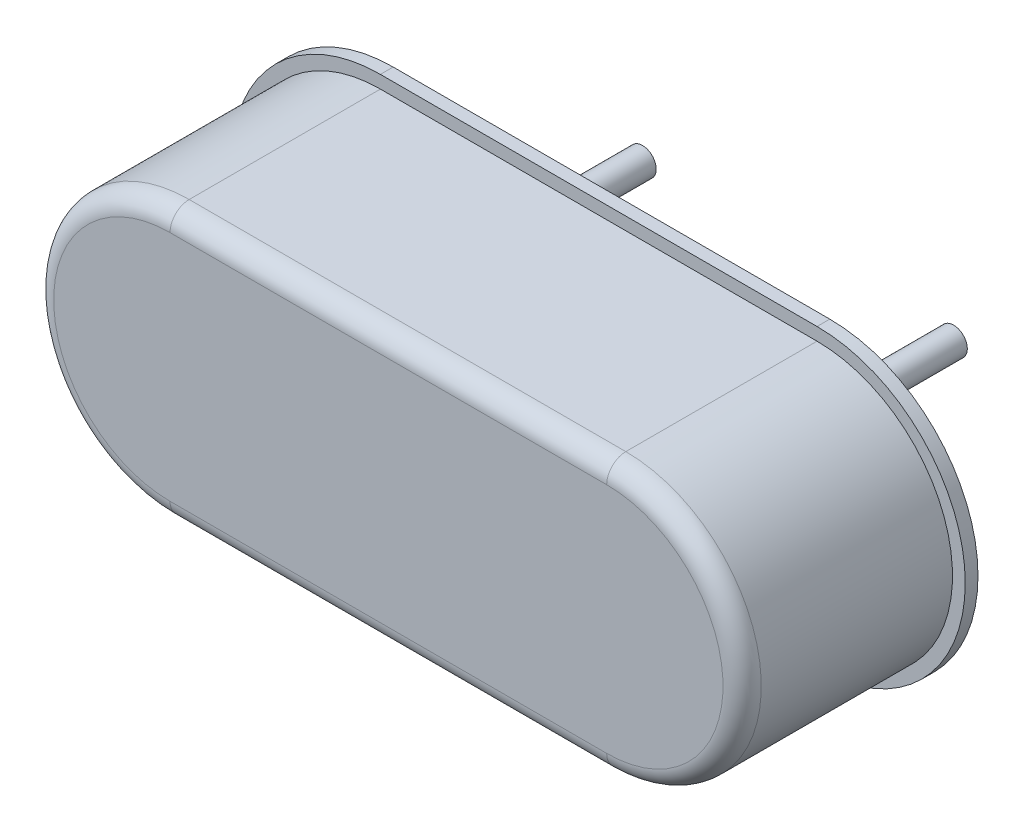
ISO-10303-21;
HEADER;
FILE_DESCRIPTION(('STEP AP214'),'2;1');
FILE_NAME('part.step','',(''),(''),'','','');
FILE_SCHEMA(('AUTOMOTIVE_DESIGN { 1 0 10303 214 1 1 1 1 }'));
ENDSEC;
DATA;
#1=APPLICATION_CONTEXT('core data for automotive mechanical design processes');
#2=APPLICATION_PROTOCOL_DEFINITION('international standard','automotive_design',2000,#1);
#3=PRODUCT_CONTEXT('',#1,'mechanical');
#4=PRODUCT('Part','Part','',(#3));
#5=PRODUCT_RELATED_PRODUCT_CATEGORY('part','',(#4));
#6=PRODUCT_DEFINITION_FORMATION('','',#4);
#7=PRODUCT_DEFINITION_CONTEXT('part definition',#1,'design');
#8=PRODUCT_DEFINITION('design','',#6,#7);
#9=PRODUCT_DEFINITION_SHAPE('','',#8);
#10=(LENGTH_UNIT() NAMED_UNIT(*) SI_UNIT(.MILLI.,.METRE.));
#11=(NAMED_UNIT(*) PLANE_ANGLE_UNIT() SI_UNIT($,.RADIAN.));
#12=(NAMED_UNIT(*) SI_UNIT($,.STERADIAN.) SOLID_ANGLE_UNIT());
#13=UNCERTAINTY_MEASURE_WITH_UNIT(LENGTH_MEASURE(1.E-05),#10,'distance_accuracy_value','');
#14=(GEOMETRIC_REPRESENTATION_CONTEXT(3) GLOBAL_UNCERTAINTY_ASSIGNED_CONTEXT((#13)) GLOBAL_UNIT_ASSIGNED_CONTEXT((#10,
#11,#12)) REPRESENTATION_CONTEXT('',''));
#15=CARTESIAN_POINT('',(0.,0.,0.));
#16=DIRECTION('',(0.,0.,1.));
#17=DIRECTION('',(1.,0.,0.));
#18=AXIS2_PLACEMENT_3D('',#15,#16,#17);
#19=CARTESIAN_POINT('',(1.4682734375,0.,-3.));
#20=DIRECTION('',(0.,0.,-1.));
#21=DIRECTION('',(0.,-1.,0.));
#22=AXIS2_PLACEMENT_3D('',#19,#20,#21);
#23=PLANE('',#22);
#24=CARTESIAN_POINT('',(2.3802734375,0.,-3.));
#25=DIRECTION('',(0.,0.,-1.));
#26=DIRECTION('',(-1.,0.,0.));
#27=AXIS2_PLACEMENT_3D('',#24,#25,#26);
#28=CIRCLE('',#27,0.215);
#29=CARTESIAN_POINT('',(2.1652734375,0.,-3.));
#30=VERTEX_POINT('',#29);
#31=EDGE_CURVE('E127',#30,#30,#28,.T.);
#32=ORIENTED_EDGE('',*,*,#31,.T.);
#33=EDGE_LOOP('',(#32));
#34=FACE_BOUND('',#33,.T.);
#35=ADVANCED_FACE('F16',(#34),#23,.T.);
#36=CARTESIAN_POINT('',(-3.4117265625,0.,-3.));
#37=DIRECTION('',(0.,0.,-1.));
#38=DIRECTION('',(0.,-1.,0.));
#39=AXIS2_PLACEMENT_3D('',#36,#37,#38);
#40=PLANE('',#39);
#41=CARTESIAN_POINT('',(-2.4997265625,0.,-3.));
#42=DIRECTION('',(0.,0.,-1.));
#43=DIRECTION('',(-1.,0.,0.));
#44=AXIS2_PLACEMENT_3D('',#41,#42,#43);
#45=CIRCLE('',#44,0.215);
#46=CARTESIAN_POINT('',(-2.7147265625,0.,-3.));
#47=VERTEX_POINT('',#46);
#48=EDGE_CURVE('E179',#47,#47,#45,.T.);
#49=ORIENTED_EDGE('',*,*,#48,.T.);
#50=EDGE_LOOP('',(#49));
#51=FACE_BOUND('',#50,.T.);
#52=ADVANCED_FACE('F198',(#51),#40,.T.);
#53=CARTESIAN_POINT('',(3.4382734375,-1.825,3.2));
#54=DIRECTION('',(1.,0.,0.));
#55=DIRECTION('',(0.,1.,0.));
#56=AXIS2_PLACEMENT_3D('',#53,#54,#55);
#57=CYLINDRICAL_SURFACE('',#56,0.3);
#58=CARTESIAN_POINT('',(-3.4117265625,-1.825,3.2));
#59=DIRECTION('',(1.,0.,0.));
#60=DIRECTION('',(0.,1.,0.));
#61=AXIS2_PLACEMENT_3D('',#58,#59,#60);
#62=CIRCLE('',#61,0.3);
#63=CARTESIAN_POINT('',(-3.4117265625,-1.825,3.5));
#64=VERTEX_POINT('',#63);
#65=CARTESIAN_POINT('',(-3.4117265625,-2.125,3.2));
#66=VERTEX_POINT('',#65);
#67=EDGE_CURVE('E11',#64,#66,#62,.T.);
#68=ORIENTED_EDGE('',*,*,#67,.T.);
#69=DIRECTION('',(-1.,0.,0.));
#70=VECTOR('',#69,1.);
#71=CARTESIAN_POINT('',(-3.4117265625,-2.125,3.2));
#72=LINE('',#71,#70);
#73=CARTESIAN_POINT('',(3.4382734375,-2.125,3.2));
#74=VERTEX_POINT('',#73);
#75=EDGE_CURVE('E161',#74,#66,#72,.T.);
#76=ORIENTED_EDGE('',*,*,#75,.F.);
#77=CARTESIAN_POINT('',(3.4382734375,-1.825,3.2));
#78=DIRECTION('',(-1.,0.,0.));
#79=DIRECTION('',(0.,0.,1.));
#80=AXIS2_PLACEMENT_3D('',#77,#78,#79);
#81=CIRCLE('',#80,0.3);
#82=CARTESIAN_POINT('',(3.4382734375,-1.825,3.5));
#83=VERTEX_POINT('',#82);
#84=EDGE_CURVE('E257',#74,#83,#81,.T.);
#85=ORIENTED_EDGE('',*,*,#84,.T.);
#86=DIRECTION('',(1.,0.,0.));
#87=VECTOR('',#86,1.);
#88=CARTESIAN_POINT('',(3.4382734375,-1.825,3.5));
#89=LINE('',#88,#87);
#90=EDGE_CURVE('E171',#64,#83,#89,.T.);
#91=ORIENTED_EDGE('',*,*,#90,.F.);
#92=EDGE_LOOP('',(#68,#76,#85,#91));
#93=FACE_BOUND('',#92,.T.);
#94=ADVANCED_FACE('F563',(#93),#57,.T.);
#95=CARTESIAN_POINT('',(-3.4117265625,0.,3.2));
#96=DIRECTION('',(0.,0.,1.));
#97=DIRECTION('',(-1.,0.,0.));
#98=AXIS2_PLACEMENT_3D('',#95,#96,#97);
#99=TOROIDAL_SURFACE('',#98,1.825,0.3);
#100=CARTESIAN_POINT('',(-3.4117265625,1.825,3.2));
#101=DIRECTION('',(-1.,0.,0.));
#102=DIRECTION('',(0.,-1.,0.));
#103=AXIS2_PLACEMENT_3D('',#100,#101,#102);
#104=CIRCLE('',#103,0.3);
#105=CARTESIAN_POINT('',(-3.4117265625,1.825,3.5));
#106=VERTEX_POINT('',#105);
#107=CARTESIAN_POINT('',(-3.4117265625,2.125,3.2));
#108=VERTEX_POINT('',#107);
#109=EDGE_CURVE('E27',#106,#108,#104,.T.);
#110=ORIENTED_EDGE('',*,*,#109,.T.);
#111=CARTESIAN_POINT('',(-3.4117265625,0.,3.2));
#112=DIRECTION('',(0.,0.,-1.));
#113=DIRECTION('',(1.,0.,0.));
#114=AXIS2_PLACEMENT_3D('',#111,#112,#113);
#115=CIRCLE('',#114,2.125);
#116=EDGE_CURVE('E157',#66,#108,#115,.T.);
#117=ORIENTED_EDGE('',*,*,#116,.F.);
#118=ORIENTED_EDGE('',*,*,#67,.F.);
#119=CARTESIAN_POINT('',(-3.4117265625,0.,3.5));
#120=DIRECTION('',(0.,0.,1.));
#121=DIRECTION('',(1.,0.,0.));
#122=AXIS2_PLACEMENT_3D('',#119,#120,#121);
#123=CIRCLE('',#122,1.825);
#124=EDGE_CURVE('E183',#106,#64,#123,.T.);
#125=ORIENTED_EDGE('',*,*,#124,.F.);
#126=EDGE_LOOP('',(#110,#117,#118,#125));
#127=FACE_BOUND('',#126,.T.);
#128=ADVANCED_FACE('F553',(#127),#99,.T.);
#129=CARTESIAN_POINT('',(3.4382734375,1.825,3.2));
#130=DIRECTION('',(-1.,0.,0.));
#131=DIRECTION('',(0.,-1.,0.));
#132=AXIS2_PLACEMENT_3D('',#129,#130,#131);
#133=CYLINDRICAL_SURFACE('',#132,0.3);
#134=CARTESIAN_POINT('',(3.4382734375,1.825,3.2));
#135=DIRECTION('',(1.,0.,0.));
#136=DIRECTION('',(0.,0.,-1.));
#137=AXIS2_PLACEMENT_3D('',#134,#135,#136);
#138=CIRCLE('',#137,0.3);
#139=CARTESIAN_POINT('',(3.4382734375,2.125,3.2));
#140=VERTEX_POINT('',#139);
#141=CARTESIAN_POINT('',(3.4382734375,1.825,3.5));
#142=VERTEX_POINT('',#141);
#143=EDGE_CURVE('E20',#140,#142,#138,.T.);
#144=ORIENTED_EDGE('',*,*,#143,.F.);
#145=DIRECTION('',(1.,0.,0.));
#146=VECTOR('',#145,1.);
#147=CARTESIAN_POINT('',(3.4382734375,2.125,3.2));
#148=LINE('',#147,#146);
#149=EDGE_CURVE('E166',#108,#140,#148,.T.);
#150=ORIENTED_EDGE('',*,*,#149,.F.);
#151=ORIENTED_EDGE('',*,*,#109,.F.);
#152=DIRECTION('',(-1.,0.,0.));
#153=VECTOR('',#152,1.);
#154=CARTESIAN_POINT('',(3.4382734375,1.825,3.5));
#155=LINE('',#154,#153);
#156=EDGE_CURVE('E167',#142,#106,#155,.T.);
#157=ORIENTED_EDGE('',*,*,#156,.F.);
#158=EDGE_LOOP('',(#144,#150,#151,#157));
#159=FACE_BOUND('',#158,.T.);
#160=ADVANCED_FACE('F306',(#159),#133,.T.);
#161=CARTESIAN_POINT('',(3.4382734375,0.,3.5));
#162=DIRECTION('',(0.,0.,1.));
#163=DIRECTION('',(1.,0.,0.));
#164=AXIS2_PLACEMENT_3D('',#161,#162,#163);
#165=PLANE('',#164);
#166=ORIENTED_EDGE('',*,*,#124,.T.);
#167=ORIENTED_EDGE('',*,*,#90,.T.);
#168=CARTESIAN_POINT('',(3.4382734375,0.,3.5));
#169=DIRECTION('',(0.,0.,1.));
#170=DIRECTION('',(1.,0.,0.));
#171=AXIS2_PLACEMENT_3D('',#168,#169,#170);
#172=CIRCLE('',#171,1.825);
#173=EDGE_CURVE('E262',#83,#142,#172,.T.);
#174=ORIENTED_EDGE('',*,*,#173,.T.);
#175=ORIENTED_EDGE('',*,*,#156,.T.);
#176=EDGE_LOOP('',(#166,#167,#174,#175));
#177=FACE_BOUND('',#176,.T.);
#178=ADVANCED_FACE('F535',(#177),#165,.T.);
#179=CARTESIAN_POINT('',(-3.4117265625,-2.125,-12.54873399989));
#180=DIRECTION('',(0.,-1.,0.));
#181=DIRECTION('',(-1.,0.,0.));
#182=AXIS2_PLACEMENT_3D('',#179,#180,#181);
#183=PLANE('',#182);
#184=DIRECTION('',(0.,0.,1.));
#185=VECTOR('',#184,1.);
#186=CARTESIAN_POINT('',(3.4382734375,-2.125,-12.54873399989));
#187=LINE('',#186,#185);
#188=CARTESIAN_POINT('',(3.4382734375,-2.125,0.2));
#189=VERTEX_POINT('',#188);
#190=EDGE_CURVE('E245',#189,#74,#187,.T.);
#191=ORIENTED_EDGE('',*,*,#190,.T.);
#192=ORIENTED_EDGE('',*,*,#75,.T.);
#193=DIRECTION('',(0.,0.,1.));
#194=VECTOR('',#193,1.);
#195=CARTESIAN_POINT('',(-3.4117265625,-2.125,-12.54873399989));
#196=LINE('',#195,#194);
#197=CARTESIAN_POINT('',(-3.4117265625,-2.125,0.2));
#198=VERTEX_POINT('',#197);
#199=EDGE_CURVE('E162',#198,#66,#196,.T.);
#200=ORIENTED_EDGE('',*,*,#199,.F.);
#201=DIRECTION('',(-1.,0.,0.));
#202=VECTOR('',#201,1.);
#203=CARTESIAN_POINT('',(-3.4117265625,-2.125,0.2));
#204=LINE('',#203,#202);
#205=EDGE_CURVE('E151',#189,#198,#204,.T.);
#206=ORIENTED_EDGE('',*,*,#205,.F.);
#207=EDGE_LOOP('',(#191,#192,#200,#206));
#208=FACE_BOUND('',#207,.T.);
#209=ADVANCED_FACE('F288',(#208),#183,.T.);
#210=CARTESIAN_POINT('',(-3.4117265625,0.,-12.54873399989));
#211=DIRECTION('',(0.,0.,1.));
#212=DIRECTION('',(-1.,0.,0.));
#213=AXIS2_PLACEMENT_3D('',#210,#211,#212);
#214=CYLINDRICAL_SURFACE('',#213,2.125);
#215=ORIENTED_EDGE('',*,*,#199,.T.);
#216=ORIENTED_EDGE('',*,*,#116,.T.);
#217=DIRECTION('',(0.,0.,1.));
#218=VECTOR('',#217,1.);
#219=CARTESIAN_POINT('',(-3.4117265625,2.125,-12.54873399989));
#220=LINE('',#219,#218);
#221=CARTESIAN_POINT('',(-3.4117265625,2.125,0.2));
#222=VERTEX_POINT('',#221);
#223=EDGE_CURVE('E150',#222,#108,#220,.T.);
#224=ORIENTED_EDGE('',*,*,#223,.F.);
#225=CARTESIAN_POINT('',(-3.4117265625,0.,0.2));
#226=DIRECTION('',(0.,0.,-1.));
#227=DIRECTION('',(1.,0.,0.));
#228=AXIS2_PLACEMENT_3D('',#225,#226,#227);
#229=CIRCLE('',#228,2.125);
#230=EDGE_CURVE('E146',#198,#222,#229,.T.);
#231=ORIENTED_EDGE('',*,*,#230,.F.);
#232=EDGE_LOOP('',(#215,#216,#224,#231));
#233=FACE_BOUND('',#232,.T.);
#234=ADVANCED_FACE('F517',(#233),#214,.T.);
#235=CARTESIAN_POINT('',(3.4382734375,2.125,-12.54873399989));
#236=DIRECTION('',(0.,1.,0.));
#237=DIRECTION('',(1.,0.,0.));
#238=AXIS2_PLACEMENT_3D('',#235,#236,#237);
#239=PLANE('',#238);
#240=ORIENTED_EDGE('',*,*,#223,.T.);
#241=ORIENTED_EDGE('',*,*,#149,.T.);
#242=DIRECTION('',(0.,0.,1.));
#243=VECTOR('',#242,1.);
#244=CARTESIAN_POINT('',(3.4382734375,2.125,-12.54873399989));
#245=LINE('',#244,#243);
#246=CARTESIAN_POINT('',(3.4382734375,2.125,0.2));
#247=VERTEX_POINT('',#246);
#248=EDGE_CURVE('E271',#247,#140,#245,.T.);
#249=ORIENTED_EDGE('',*,*,#248,.F.);
#250=DIRECTION('',(1.,0.,0.));
#251=VECTOR('',#250,1.);
#252=CARTESIAN_POINT('',(3.4382734375,2.125,0.2));
#253=LINE('',#252,#251);
#254=EDGE_CURVE('E224',#222,#247,#253,.T.);
#255=ORIENTED_EDGE('',*,*,#254,.F.);
#256=EDGE_LOOP('',(#240,#241,#249,#255));
#257=FACE_BOUND('',#256,.T.);
#258=ADVANCED_FACE('F18',(#257),#239,.T.);
#259=CARTESIAN_POINT('',(3.4382734375,0.,0.2));
#260=DIRECTION('',(0.,0.,1.));
#261=DIRECTION('',(1.,0.,0.));
#262=AXIS2_PLACEMENT_3D('',#259,#260,#261);
#263=PLANE('',#262);
#264=ORIENTED_EDGE('',*,*,#254,.T.);
#265=CARTESIAN_POINT('',(3.4382734375,0.,0.2));
#266=DIRECTION('',(0.,0.,-1.));
#267=DIRECTION('',(1.,0.,0.));
#268=AXIS2_PLACEMENT_3D('',#265,#266,#267);
#269=CIRCLE('',#268,2.125);
#270=EDGE_CURVE('E261',#247,#189,#269,.T.);
#271=ORIENTED_EDGE('',*,*,#270,.T.);
#272=ORIENTED_EDGE('',*,*,#205,.T.);
#273=ORIENTED_EDGE('',*,*,#230,.T.);
#274=EDGE_LOOP('',(#264,#271,#272,#273));
#275=FACE_BOUND('',#274,.T.);
#276=CARTESIAN_POINT('',(3.4382734375,0.,0.2));
#277=DIRECTION('',(0.,0.,1.));
#278=DIRECTION('',(1.,0.,0.));
#279=AXIS2_PLACEMENT_3D('',#276,#277,#278);
#280=CIRCLE('',#279,2.325);
#281=CARTESIAN_POINT('',(3.4382734375,-2.325,0.2));
#282=VERTEX_POINT('',#281);
#283=CARTESIAN_POINT('',(3.4382734375,2.325,0.2));
#284=VERTEX_POINT('',#283);
#285=EDGE_CURVE('E156',#282,#284,#280,.T.);
#286=ORIENTED_EDGE('',*,*,#285,.T.);
#287=DIRECTION('',(-1.,0.,0.));
#288=VECTOR('',#287,1.);
#289=CARTESIAN_POINT('',(-3.4117265625,2.325,0.2));
#290=LINE('',#289,#288);
#291=CARTESIAN_POINT('',(-3.4117265625,2.325,0.2));
#292=VERTEX_POINT('',#291);
#293=EDGE_CURVE('E247',#284,#292,#290,.T.);
#294=ORIENTED_EDGE('',*,*,#293,.T.);
#295=CARTESIAN_POINT('',(-3.4117265625,0.,0.2));
#296=DIRECTION('',(0.,0.,1.));
#297=DIRECTION('',(1.,0.,0.));
#298=AXIS2_PLACEMENT_3D('',#295,#296,#297);
#299=CIRCLE('',#298,2.325);
#300=CARTESIAN_POINT('',(-3.4117265625,-2.325,0.2));
#301=VERTEX_POINT('',#300);
#302=EDGE_CURVE('E191',#292,#301,#299,.T.);
#303=ORIENTED_EDGE('',*,*,#302,.T.);
#304=DIRECTION('',(1.,0.,0.));
#305=VECTOR('',#304,1.);
#306=CARTESIAN_POINT('',(-3.4117265625,-2.325,0.2));
#307=LINE('',#306,#305);
#308=EDGE_CURVE('E227',#301,#282,#307,.T.);
#309=ORIENTED_EDGE('',*,*,#308,.T.);
#310=EDGE_LOOP('',(#286,#294,#303,#309));
#311=FACE_BOUND('',#310,.T.);
#312=ADVANCED_FACE('F498',(#275,#311),#263,.T.);
#313=CARTESIAN_POINT('',(-3.4117265625,-2.325,3.5));
#314=DIRECTION('',(0.,1.,0.));
#315=DIRECTION('',(0.,0.,-1.));
#316=AXIS2_PLACEMENT_3D('',#313,#314,#315);
#317=PLANE('',#316);
#318=ORIENTED_EDGE('',*,*,#308,.F.);
#319=DIRECTION('',(0.,0.,-1.));
#320=VECTOR('',#319,1.);
#321=CARTESIAN_POINT('',(-3.4117265625,-2.325,3.5));
#322=LINE('',#321,#320);
#323=CARTESIAN_POINT('',(-3.4117265625,-2.325,0.));
#324=VERTEX_POINT('',#323);
#325=EDGE_CURVE('E215',#301,#324,#322,.T.);
#326=ORIENTED_EDGE('',*,*,#325,.T.);
#327=DIRECTION('',(1.,0.,0.));
#328=VECTOR('',#327,1.);
#329=CARTESIAN_POINT('',(-3.4117265625,-2.325,0.));
#330=LINE('',#329,#328);
#331=CARTESIAN_POINT('',(3.4382734375,-2.325,0.));
#332=VERTEX_POINT('',#331);
#333=EDGE_CURVE('E78',#324,#332,#330,.T.);
#334=ORIENTED_EDGE('',*,*,#333,.T.);
#335=DIRECTION('',(0.,0.,-1.));
#336=VECTOR('',#335,1.);
#337=CARTESIAN_POINT('',(3.4382734375,-2.325,3.5));
#338=LINE('',#337,#336);
#339=EDGE_CURVE('E152',#282,#332,#338,.T.);
#340=ORIENTED_EDGE('',*,*,#339,.F.);
#341=EDGE_LOOP('',(#318,#326,#334,#340));
#342=FACE_BOUND('',#341,.T.);
#343=ADVANCED_FACE('F486',(#342),#317,.F.);
#344=CARTESIAN_POINT('',(-3.4117265625,2.325,3.5));
#345=DIRECTION('',(0.,-1.,0.));
#346=DIRECTION('',(-1.,0.,0.));
#347=AXIS2_PLACEMENT_3D('',#344,#345,#346);
#348=PLANE('',#347);
#349=ORIENTED_EDGE('',*,*,#293,.F.);
#350=DIRECTION('',(0.,0.,-1.));
#351=VECTOR('',#350,1.);
#352=CARTESIAN_POINT('',(3.4382734375,2.325,3.5));
#353=LINE('',#352,#351);
#354=CARTESIAN_POINT('',(3.4382734375,2.325,0.));
#355=VERTEX_POINT('',#354);
#356=EDGE_CURVE('E155',#284,#355,#353,.T.);
#357=ORIENTED_EDGE('',*,*,#356,.T.);
#358=DIRECTION('',(-1.,0.,0.));
#359=VECTOR('',#358,1.);
#360=CARTESIAN_POINT('',(-3.4117265625,2.325,0.));
#361=LINE('',#360,#359);
#362=CARTESIAN_POINT('',(-3.4117265625,2.325,0.));
#363=VERTEX_POINT('',#362);
#364=EDGE_CURVE('E92',#355,#363,#361,.T.);
#365=ORIENTED_EDGE('',*,*,#364,.T.);
#366=DIRECTION('',(0.,0.,-1.));
#367=VECTOR('',#366,1.);
#368=CARTESIAN_POINT('',(-3.4117265625,2.325,3.5));
#369=LINE('',#368,#367);
#370=EDGE_CURVE('E187',#292,#363,#369,.T.);
#371=ORIENTED_EDGE('',*,*,#370,.F.);
#372=EDGE_LOOP('',(#349,#357,#365,#371));
#373=FACE_BOUND('',#372,.T.);
#374=ADVANCED_FACE('F475',(#373),#348,.F.);
#375=CARTESIAN_POINT('',(3.4382734375,0.,3.5));
#376=DIRECTION('',(0.,0.,-1.));
#377=DIRECTION('',(1.,0.,0.));
#378=AXIS2_PLACEMENT_3D('',#375,#376,#377);
#379=CYLINDRICAL_SURFACE('',#378,2.325);
#380=ORIENTED_EDGE('',*,*,#285,.F.);
#381=ORIENTED_EDGE('',*,*,#339,.T.);
#382=CARTESIAN_POINT('',(3.4382734375,0.,0.));
#383=DIRECTION('',(0.,0.,1.));
#384=DIRECTION('',(1.,0.,0.));
#385=AXIS2_PLACEMENT_3D('',#382,#383,#384);
#386=CIRCLE('',#385,2.325);
#387=EDGE_CURVE('E211',#332,#355,#386,.T.);
#388=ORIENTED_EDGE('',*,*,#387,.T.);
#389=ORIENTED_EDGE('',*,*,#356,.F.);
#390=EDGE_LOOP('',(#380,#381,#388,#389));
#391=FACE_BOUND('',#390,.T.);
#392=ADVANCED_FACE('F207',(#391),#379,.T.);
#393=CARTESIAN_POINT('',(3.4382734375,0.,0.));
#394=DIRECTION('',(0.,0.,1.));
#395=DIRECTION('',(1.,0.,0.));
#396=AXIS2_PLACEMENT_3D('',#393,#394,#395);
#397=PLANE('',#396);
#398=CARTESIAN_POINT('',(-2.4997265625,0.,0.));
#399=DIRECTION('',(0.,0.,-1.));
#400=DIRECTION('',(1.,0.,0.));
#401=AXIS2_PLACEMENT_3D('',#398,#399,#400);
#402=CIRCLE('',#401,0.215);
#403=CARTESIAN_POINT('',(-2.7147265625,0.,0.));
#404=VERTEX_POINT('',#403);
#405=EDGE_CURVE('E131',#404,#404,#402,.T.);
#406=ORIENTED_EDGE('',*,*,#405,.F.);
#407=EDGE_LOOP('',(#406));
#408=FACE_BOUND('',#407,.T.);
#409=CARTESIAN_POINT('',(2.3802734375,0.,0.));
#410=DIRECTION('',(0.,0.,-1.));
#411=DIRECTION('',(1.,0.,0.));
#412=AXIS2_PLACEMENT_3D('',#409,#410,#411);
#413=CIRCLE('',#412,0.215);
#414=CARTESIAN_POINT('',(2.1652734375,0.,0.));
#415=VERTEX_POINT('',#414);
#416=EDGE_CURVE('E142',#415,#415,#413,.T.);
#417=ORIENTED_EDGE('',*,*,#416,.F.);
#418=EDGE_LOOP('',(#417));
#419=FACE_BOUND('',#418,.T.);
#420=ORIENTED_EDGE('',*,*,#387,.F.);
#421=ORIENTED_EDGE('',*,*,#333,.F.);
#422=CARTESIAN_POINT('',(-3.4117265625,0.,0.));
#423=DIRECTION('',(0.,0.,1.));
#424=DIRECTION('',(1.,0.,0.));
#425=AXIS2_PLACEMENT_3D('',#422,#423,#424);
#426=CIRCLE('',#425,2.325);
#427=EDGE_CURVE('E190',#363,#324,#426,.T.);
#428=ORIENTED_EDGE('',*,*,#427,.F.);
#429=ORIENTED_EDGE('',*,*,#364,.F.);
#430=EDGE_LOOP('',(#420,#421,#428,#429));
#431=FACE_BOUND('',#430,.T.);
#432=ADVANCED_FACE('F203',(#408,#419,#431),#397,.F.);
#433=CARTESIAN_POINT('',(-3.4117265625,0.,3.5));
#434=DIRECTION('',(0.,0.,-1.));
#435=DIRECTION('',(-1.,0.,0.));
#436=AXIS2_PLACEMENT_3D('',#433,#434,#435);
#437=CYLINDRICAL_SURFACE('',#436,2.325);
#438=ORIENTED_EDGE('',*,*,#302,.F.);
#439=ORIENTED_EDGE('',*,*,#370,.T.);
#440=ORIENTED_EDGE('',*,*,#427,.T.);
#441=ORIENTED_EDGE('',*,*,#325,.F.);
#442=EDGE_LOOP('',(#438,#439,#440,#441));
#443=FACE_BOUND('',#442,.T.);
#444=ADVANCED_FACE('F206',(#443),#437,.T.);
#445=CARTESIAN_POINT('',(3.4382734375,0.,-12.54873399989));
#446=DIRECTION('',(0.,0.,1.));
#447=DIRECTION('',(1.,0.,0.));
#448=AXIS2_PLACEMENT_3D('',#445,#446,#447);
#449=CYLINDRICAL_SURFACE('',#448,2.125);
#450=ORIENTED_EDGE('',*,*,#270,.F.);
#451=ORIENTED_EDGE('',*,*,#248,.T.);
#452=CARTESIAN_POINT('',(3.4382734375,0.,3.2));
#453=DIRECTION('',(0.,0.,-1.));
#454=DIRECTION('',(1.,0.,0.));
#455=AXIS2_PLACEMENT_3D('',#452,#453,#454);
#456=CIRCLE('',#455,2.125);
#457=EDGE_CURVE('E175',#140,#74,#456,.T.);
#458=ORIENTED_EDGE('',*,*,#457,.T.);
#459=ORIENTED_EDGE('',*,*,#190,.F.);
#460=EDGE_LOOP('',(#450,#451,#458,#459));
#461=FACE_BOUND('',#460,.T.);
#462=ADVANCED_FACE('F297',(#461),#449,.T.);
#463=CARTESIAN_POINT('',(3.4382734375,0.,3.2));
#464=DIRECTION('',(0.,0.,1.));
#465=DIRECTION('',(1.,0.,0.));
#466=AXIS2_PLACEMENT_3D('',#463,#464,#465);
#467=TOROIDAL_SURFACE('',#466,1.825,0.3);
#468=ORIENTED_EDGE('',*,*,#457,.F.);
#469=ORIENTED_EDGE('',*,*,#143,.T.);
#470=ORIENTED_EDGE('',*,*,#173,.F.);
#471=ORIENTED_EDGE('',*,*,#84,.F.);
#472=EDGE_LOOP('',(#468,#469,#470,#471));
#473=FACE_BOUND('',#472,.T.);
#474=ADVANCED_FACE('F294',(#473),#467,.T.);
#475=CARTESIAN_POINT('',(-2.4997265625,0.,-3.));
#476=DIRECTION('',(0.,0.,1.));
#477=DIRECTION('',(1.,0.,0.));
#478=AXIS2_PLACEMENT_3D('',#475,#476,#477);
#479=CYLINDRICAL_SURFACE('',#478,0.215);
#480=ORIENTED_EDGE('',*,*,#405,.T.);
#481=DIRECTION('',(0.,0.,-1.));
#482=VECTOR('',#481,1.);
#483=CARTESIAN_POINT('',(-2.7147265625,0.,-3.));
#484=LINE('',#483,#482);
#485=EDGE_CURVE('E140',#404,#47,#484,.T.);
#486=ORIENTED_EDGE('',*,*,#485,.T.);
#487=ORIENTED_EDGE('',*,*,#48,.F.);
#488=ORIENTED_EDGE('',*,*,#485,.F.);
#489=EDGE_LOOP('',(#480,#486,#487,#488));
#490=FACE_BOUND('',#489,.T.);
#491=ADVANCED_FACE('F200',(#490),#479,.T.);
#492=CARTESIAN_POINT('',(2.3802734375,0.,-3.));
#493=DIRECTION('',(0.,0.,1.));
#494=DIRECTION('',(1.,0.,0.));
#495=AXIS2_PLACEMENT_3D('',#492,#493,#494);
#496=CYLINDRICAL_SURFACE('',#495,0.215);
#497=ORIENTED_EDGE('',*,*,#416,.T.);
#498=DIRECTION('',(0.,0.,-1.));
#499=VECTOR('',#498,1.);
#500=CARTESIAN_POINT('',(2.1652734375,0.,-3.));
#501=LINE('',#500,#499);
#502=EDGE_CURVE('E132',#415,#30,#501,.T.);
#503=ORIENTED_EDGE('',*,*,#502,.T.);
#504=ORIENTED_EDGE('',*,*,#31,.F.);
#505=ORIENTED_EDGE('',*,*,#502,.F.);
#506=EDGE_LOOP('',(#497,#503,#504,#505));
#507=FACE_BOUND('',#506,.T.);
#508=ADVANCED_FACE('F411',(#507),#496,.T.);
#509=CLOSED_SHELL('',(#35,#52,#94,#128,#160,#178,#209,#234,#258,#312,#343,#374,#392,#432,#444,
#462,#474,#491,#508));
#510=MANIFOLD_SOLID_BREP('B1',#509);
#511=ADVANCED_BREP_SHAPE_REPRESENTATION('',(#18,#510),#14);
#512=SHAPE_DEFINITION_REPRESENTATION(#9,#511);
ENDSEC;
END-ISO-10303-21;
